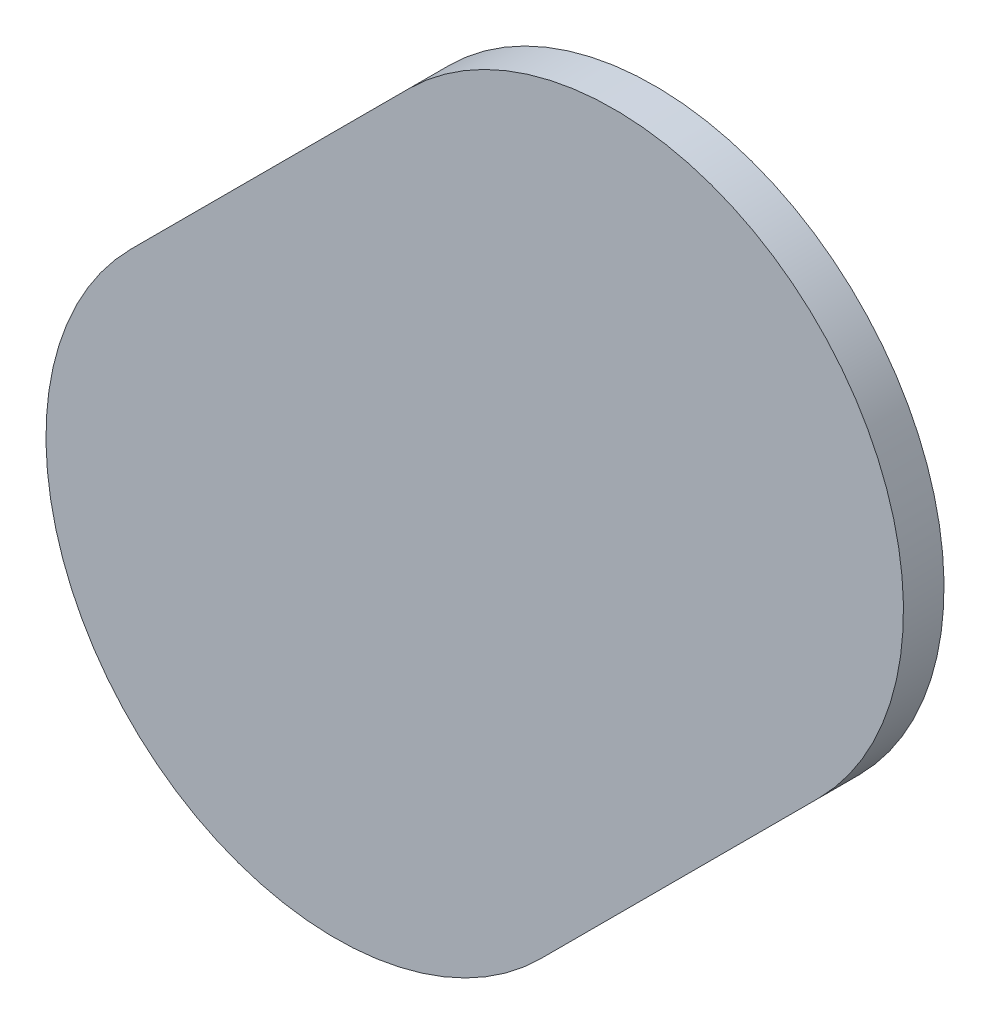
ISO-10303-21;
HEADER;
FILE_DESCRIPTION(('STEP AP214'),'2;1');
FILE_NAME('part.step','',(''),(''),'','','');
FILE_SCHEMA(('AUTOMOTIVE_DESIGN { 1 0 10303 214 1 1 1 1 }'));
ENDSEC;
DATA;
#1=APPLICATION_CONTEXT('core data for automotive mechanical design processes');
#2=APPLICATION_PROTOCOL_DEFINITION('international standard','automotive_design',2000,#1);
#3=PRODUCT_CONTEXT('',#1,'mechanical');
#4=PRODUCT('Part','Part','',(#3));
#5=PRODUCT_RELATED_PRODUCT_CATEGORY('part','',(#4));
#6=PRODUCT_DEFINITION_FORMATION('','',#4);
#7=PRODUCT_DEFINITION_CONTEXT('part definition',#1,'design');
#8=PRODUCT_DEFINITION('design','',#6,#7);
#9=PRODUCT_DEFINITION_SHAPE('','',#8);
#10=(LENGTH_UNIT() NAMED_UNIT(*) SI_UNIT(.MILLI.,.METRE.));
#11=(NAMED_UNIT(*) PLANE_ANGLE_UNIT() SI_UNIT($,.RADIAN.));
#12=(NAMED_UNIT(*) SI_UNIT($,.STERADIAN.) SOLID_ANGLE_UNIT());
#13=UNCERTAINTY_MEASURE_WITH_UNIT(LENGTH_MEASURE(1.E-05),#10,'distance_accuracy_value','');
#14=(GEOMETRIC_REPRESENTATION_CONTEXT(3) GLOBAL_UNCERTAINTY_ASSIGNED_CONTEXT((#13)) GLOBAL_UNIT_ASSIGNED_CONTEXT((#10,
#11,#12)) REPRESENTATION_CONTEXT('',''));
#15=CARTESIAN_POINT('',(0.,0.,0.));
#16=DIRECTION('',(0.,0.,1.));
#17=DIRECTION('',(1.,0.,0.));
#18=AXIS2_PLACEMENT_3D('',#15,#16,#17);
#19=CARTESIAN_POINT('',(99.103223,-105.513224,1.635));
#20=DIRECTION('',(0.,0.,1.));
#21=DIRECTION('',(1.,0.,0.));
#22=AXIS2_PLACEMENT_3D('',#19,#20,#21);
#23=PLANE('',#22);
#24=DIRECTION('',(-0.707106781186548,-0.707106781186548,0.));
#25=VECTOR('',#24,1.);
#26=CARTESIAN_POINT('',(99.103223,-105.513224,1.635));
#27=LINE('',#26,#25);
#28=CARTESIAN_POINT('',(99.103223,-105.513224,1.635));
#29=VERTEX_POINT('',#28);
#30=CARTESIAN_POINT('',(98.863223,-105.753224,1.635));
#31=VERTEX_POINT('',#30);
#32=EDGE_CURVE('E68',#29,#31,#27,.T.);
#33=ORIENTED_EDGE('',*,*,#32,.T.);
#34=CARTESIAN_POINT('',(99.0399995,-105.9300005,1.635));
#35=DIRECTION('',(0.,0.,1.));
#36=DIRECTION('',(-0.707106781186548,0.707106781186548,0.));
#37=AXIS2_PLACEMENT_3D('',#34,#35,#36);
#38=CIRCLE('',#37,0.249999723809);
#39=CARTESIAN_POINT('',(99.216776,-106.106777,1.635));
#40=VERTEX_POINT('',#39);
#41=EDGE_CURVE('E96',#31,#40,#38,.T.);
#42=ORIENTED_EDGE('',*,*,#41,.T.);
#43=DIRECTION('',(0.707106781186548,0.707106781186548,0.));
#44=VECTOR('',#43,1.);
#45=CARTESIAN_POINT('',(99.216776,-106.106777,1.635));
#46=LINE('',#45,#44);
#47=CARTESIAN_POINT('',(99.456776,-105.866777,1.635));
#48=VERTEX_POINT('',#47);
#49=EDGE_CURVE('E20',#40,#48,#46,.T.);
#50=ORIENTED_EDGE('',*,*,#49,.T.);
#51=CARTESIAN_POINT('',(99.2799995,-105.6900005,1.635));
#52=DIRECTION('',(0.,0.,1.));
#53=DIRECTION('',(0.707106781186548,-0.707106781186548,0.));
#54=AXIS2_PLACEMENT_3D('',#51,#52,#53);
#55=CIRCLE('',#54,0.249999723809);
#56=EDGE_CURVE('E11',#48,#29,#55,.T.);
#57=ORIENTED_EDGE('',*,*,#56,.T.);
#58=EDGE_LOOP('',(#33,#42,#50,#57));
#59=FACE_BOUND('',#58,.T.);
#60=ADVANCED_FACE('F17',(#59),#23,.T.);
#61=CARTESIAN_POINT('',(99.103223,-105.513224,1.6));
#62=DIRECTION('',(0.,0.,1.));
#63=DIRECTION('',(1.,0.,0.));
#64=AXIS2_PLACEMENT_3D('',#61,#62,#63);
#65=PLANE('',#64);
#66=CARTESIAN_POINT('',(99.2799995,-105.6900005,1.6));
#67=DIRECTION('',(0.,0.,1.));
#68=DIRECTION('',(0.707106781186548,-0.707106781186548,0.));
#69=AXIS2_PLACEMENT_3D('',#66,#67,#68);
#70=CIRCLE('',#69,0.249999723809);
#71=CARTESIAN_POINT('',(99.456776,-105.866777,1.6));
#72=VERTEX_POINT('',#71);
#73=CARTESIAN_POINT('',(99.103223,-105.513224,1.6));
#74=VERTEX_POINT('',#73);
#75=EDGE_CURVE('E27',#72,#74,#70,.T.);
#76=ORIENTED_EDGE('',*,*,#75,.F.);
#77=DIRECTION('',(0.707106781186548,0.707106781186548,0.));
#78=VECTOR('',#77,1.);
#79=CARTESIAN_POINT('',(99.216776,-106.106777,1.6));
#80=LINE('',#79,#78);
#81=CARTESIAN_POINT('',(99.216776,-106.106777,1.6));
#82=VERTEX_POINT('',#81);
#83=EDGE_CURVE('E99',#82,#72,#80,.T.);
#84=ORIENTED_EDGE('',*,*,#83,.F.);
#85=CARTESIAN_POINT('',(99.0399995,-105.9300005,1.6));
#86=DIRECTION('',(0.,0.,1.));
#87=DIRECTION('',(-0.707106781186548,0.707106781186548,0.));
#88=AXIS2_PLACEMENT_3D('',#85,#86,#87);
#89=CIRCLE('',#88,0.249999723809);
#90=CARTESIAN_POINT('',(98.863223,-105.753224,1.6));
#91=VERTEX_POINT('',#90);
#92=EDGE_CURVE('E78',#91,#82,#89,.T.);
#93=ORIENTED_EDGE('',*,*,#92,.F.);
#94=DIRECTION('',(-0.707106781186548,-0.707106781186548,0.));
#95=VECTOR('',#94,1.);
#96=CARTESIAN_POINT('',(99.103223,-105.513224,1.6));
#97=LINE('',#96,#95);
#98=EDGE_CURVE('E89',#74,#91,#97,.T.);
#99=ORIENTED_EDGE('',*,*,#98,.F.);
#100=EDGE_LOOP('',(#76,#84,#93,#99));
#101=FACE_BOUND('',#100,.T.);
#102=ADVANCED_FACE('F160',(#101),#65,.F.);
#103=CARTESIAN_POINT('',(99.2799995,-105.6900005,1.6));
#104=DIRECTION('',(0.,0.,-1.));
#105=DIRECTION('',(0.707106781186548,-0.707106781186548,0.));
#106=AXIS2_PLACEMENT_3D('',#103,#104,#105);
#107=CYLINDRICAL_SURFACE('',#106,0.249999723809);
#108=ORIENTED_EDGE('',*,*,#75,.T.);
#109=DIRECTION('',(0.,0.,1.));
#110=VECTOR('',#109,1.);
#111=CARTESIAN_POINT('',(99.103223,-105.513224,1.6));
#112=LINE('',#111,#110);
#113=EDGE_CURVE('E72',#74,#29,#112,.T.);
#114=ORIENTED_EDGE('',*,*,#113,.T.);
#115=ORIENTED_EDGE('',*,*,#56,.F.);
#116=DIRECTION('',(0.,0.,1.));
#117=VECTOR('',#116,1.);
#118=CARTESIAN_POINT('',(99.456776,-105.866777,1.6));
#119=LINE('',#118,#117);
#120=EDGE_CURVE('E107',#72,#48,#119,.T.);
#121=ORIENTED_EDGE('',*,*,#120,.F.);
#122=EDGE_LOOP('',(#108,#114,#115,#121));
#123=FACE_BOUND('',#122,.T.);
#124=ADVANCED_FACE('F73',(#123),#107,.T.);
#125=CARTESIAN_POINT('',(99.216776,-106.106777,1.6));
#126=DIRECTION('',(-0.707106781186548,0.707106781186548,0.));
#127=DIRECTION('',(0.,0.,1.));
#128=AXIS2_PLACEMENT_3D('',#125,#126,#127);
#129=PLANE('',#128);
#130=ORIENTED_EDGE('',*,*,#83,.T.);
#131=ORIENTED_EDGE('',*,*,#120,.T.);
#132=ORIENTED_EDGE('',*,*,#49,.F.);
#133=DIRECTION('',(0.,0.,1.));
#134=VECTOR('',#133,1.);
#135=CARTESIAN_POINT('',(99.216776,-106.106777,1.6));
#136=LINE('',#135,#134);
#137=EDGE_CURVE('E95',#82,#40,#136,.T.);
#138=ORIENTED_EDGE('',*,*,#137,.F.);
#139=EDGE_LOOP('',(#130,#131,#132,#138));
#140=FACE_BOUND('',#139,.T.);
#141=ADVANCED_FACE('F142',(#140),#129,.F.);
#142=CARTESIAN_POINT('',(99.0399995,-105.9300005,1.6));
#143=DIRECTION('',(0.,0.,-1.));
#144=DIRECTION('',(-0.707106781186548,0.707106781186548,0.));
#145=AXIS2_PLACEMENT_3D('',#142,#143,#144);
#146=CYLINDRICAL_SURFACE('',#145,0.249999723809);
#147=ORIENTED_EDGE('',*,*,#92,.T.);
#148=ORIENTED_EDGE('',*,*,#137,.T.);
#149=ORIENTED_EDGE('',*,*,#41,.F.);
#150=DIRECTION('',(0.,0.,1.));
#151=VECTOR('',#150,1.);
#152=CARTESIAN_POINT('',(98.863223,-105.753224,1.6));
#153=LINE('',#152,#151);
#154=EDGE_CURVE('E82',#91,#31,#153,.T.);
#155=ORIENTED_EDGE('',*,*,#154,.F.);
#156=EDGE_LOOP('',(#147,#148,#149,#155));
#157=FACE_BOUND('',#156,.T.);
#158=ADVANCED_FACE('F132',(#157),#146,.T.);
#159=CARTESIAN_POINT('',(99.103223,-105.513224,1.6));
#160=DIRECTION('',(0.707106781186548,-0.707106781186548,0.));
#161=DIRECTION('',(0.,0.,-1.));
#162=AXIS2_PLACEMENT_3D('',#159,#160,#161);
#163=PLANE('',#162);
#164=ORIENTED_EDGE('',*,*,#98,.T.);
#165=ORIENTED_EDGE('',*,*,#154,.T.);
#166=ORIENTED_EDGE('',*,*,#32,.F.);
#167=ORIENTED_EDGE('',*,*,#113,.F.);
#168=EDGE_LOOP('',(#164,#165,#166,#167));
#169=FACE_BOUND('',#168,.T.);
#170=ADVANCED_FACE('F80',(#169),#163,.F.);
#171=CLOSED_SHELL('',(#60,#102,#124,#141,#158,#170));
#172=MANIFOLD_SOLID_BREP('B1',#171);
#173=ADVANCED_BREP_SHAPE_REPRESENTATION('',(#18,#172),#14);
#174=SHAPE_DEFINITION_REPRESENTATION(#9,#173);
ENDSEC;
END-ISO-10303-21;
